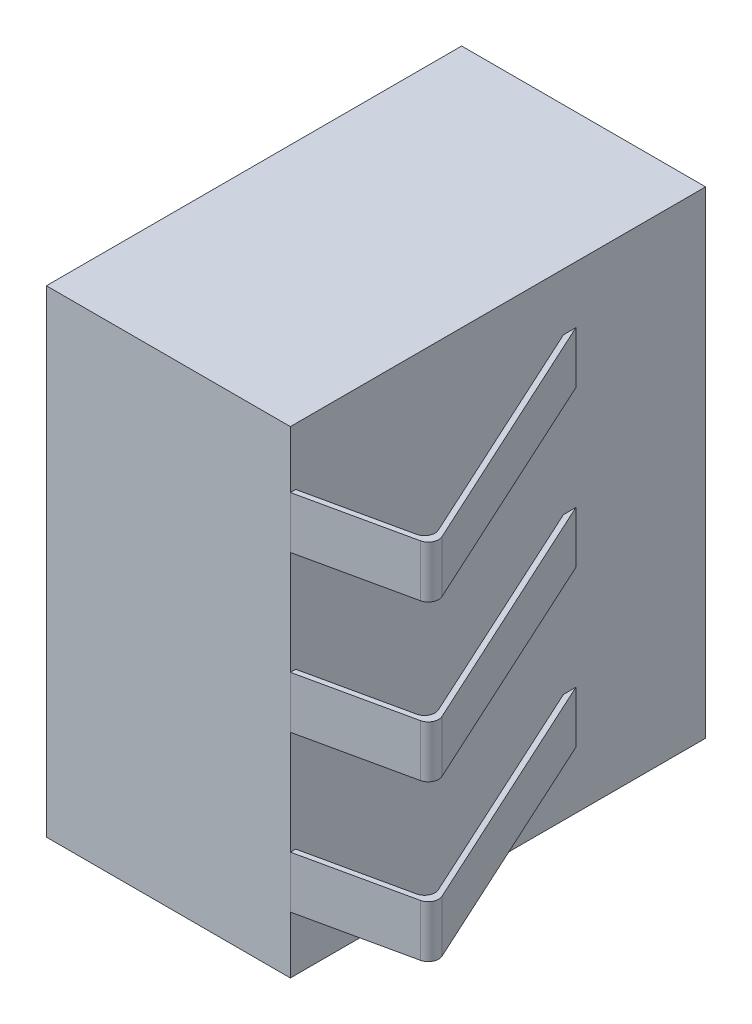
ISO-10303-21;
HEADER;
FILE_DESCRIPTION(('STEP AP214'),'2;1');
FILE_NAME('part.step','',(''),(''),'','','');
FILE_SCHEMA(('AUTOMOTIVE_DESIGN { 1 0 10303 214 1 1 1 1 }'));
ENDSEC;
DATA;
#1=APPLICATION_CONTEXT('core data for automotive mechanical design processes');
#2=APPLICATION_PROTOCOL_DEFINITION('international standard','automotive_design',2000,#1);
#3=PRODUCT_CONTEXT('',#1,'mechanical');
#4=PRODUCT('Part','Part','',(#3));
#5=PRODUCT_RELATED_PRODUCT_CATEGORY('part','',(#4));
#6=PRODUCT_DEFINITION_FORMATION('','',#4);
#7=PRODUCT_DEFINITION_CONTEXT('part definition',#1,'design');
#8=PRODUCT_DEFINITION('design','',#6,#7);
#9=PRODUCT_DEFINITION_SHAPE('','',#8);
#10=(LENGTH_UNIT() NAMED_UNIT(*) SI_UNIT(.MILLI.,.METRE.));
#11=(NAMED_UNIT(*) PLANE_ANGLE_UNIT() SI_UNIT($,.RADIAN.));
#12=(NAMED_UNIT(*) SI_UNIT($,.STERADIAN.) SOLID_ANGLE_UNIT());
#13=UNCERTAINTY_MEASURE_WITH_UNIT(LENGTH_MEASURE(1.E-05),#10,'distance_accuracy_value','');
#14=(GEOMETRIC_REPRESENTATION_CONTEXT(3) GLOBAL_UNCERTAINTY_ASSIGNED_CONTEXT((#13)) GLOBAL_UNIT_ASSIGNED_CONTEXT((#10,
#11,#12)) REPRESENTATION_CONTEXT('',''));
#15=CARTESIAN_POINT('',(0.,0.,0.));
#16=DIRECTION('',(0.,0.,1.));
#17=DIRECTION('',(1.,0.,0.));
#18=AXIS2_PLACEMENT_3D('',#15,#16,#17);
#19=CARTESIAN_POINT('',(2.35,-4.6,8.));
#20=DIRECTION('',(-1.,0.,0.));
#21=DIRECTION('',(0.,0.,1.));
#22=AXIS2_PLACEMENT_3D('',#19,#20,#21);
#23=PLANE('',#22);
#24=DIRECTION('',(0.,-1.,0.));
#25=VECTOR('',#24,1.);
#26=CARTESIAN_POINT('',(2.35,-2.5,2.73928848531856));
#27=LINE('',#26,#25);
#28=CARTESIAN_POINT('',(2.35,-2.5,2.73928848531856));
#29=VERTEX_POINT('',#28);
#30=CARTESIAN_POINT('',(2.35,-3.5,2.73928848531856));
#31=VERTEX_POINT('',#30);
#32=EDGE_CURVE('E239',#29,#31,#27,.T.);
#33=ORIENTED_EDGE('',*,*,#32,.F.);
#34=DIRECTION('',(0.,0.,1.));
#35=VECTOR('',#34,1.);
#36=CARTESIAN_POINT('',(2.35,-2.5,2.5));
#37=LINE('',#36,#35);
#38=CARTESIAN_POINT('',(2.35,-2.5,2.5));
#39=VERTEX_POINT('',#38);
#40=EDGE_CURVE('E253',#39,#29,#37,.T.);
#41=ORIENTED_EDGE('',*,*,#40,.F.);
#42=DIRECTION('',(0.,-1.,0.));
#43=VECTOR('',#42,1.);
#44=CARTESIAN_POINT('',(2.35,-2.5,2.5));
#45=LINE('',#44,#43);
#46=CARTESIAN_POINT('',(2.35,-3.5,2.5));
#47=VERTEX_POINT('',#46);
#48=EDGE_CURVE('E269',#39,#47,#45,.T.);
#49=ORIENTED_EDGE('',*,*,#48,.T.);
#50=DIRECTION('',(0.,0.,1.));
#51=VECTOR('',#50,1.);
#52=CARTESIAN_POINT('',(2.35,-3.5,2.5));
#53=LINE('',#52,#51);
#54=EDGE_CURVE('E263',#47,#31,#53,.T.);
#55=ORIENTED_EDGE('',*,*,#54,.T.);
#56=EDGE_LOOP('',(#33,#41,#49,#55));
#57=FACE_BOUND('',#56,.T.);
#58=DIRECTION('',(0.,-1.,0.));
#59=VECTOR('',#58,1.);
#60=CARTESIAN_POINT('',(2.35,3.5,2.73928848531856));
#61=LINE('',#60,#59);
#62=CARTESIAN_POINT('',(2.35,3.5,2.73928848531856));
#63=VERTEX_POINT('',#62);
#64=CARTESIAN_POINT('',(2.35,2.5,2.73928848531856));
#65=VERTEX_POINT('',#64);
#66=EDGE_CURVE('E308',#63,#65,#61,.T.);
#67=ORIENTED_EDGE('',*,*,#66,.F.);
#68=DIRECTION('',(0.,0.,1.));
#69=VECTOR('',#68,1.);
#70=CARTESIAN_POINT('',(2.35,3.5,2.5));
#71=LINE('',#70,#69);
#72=CARTESIAN_POINT('',(2.35,3.5,2.5));
#73=VERTEX_POINT('',#72);
#74=EDGE_CURVE('E284',#73,#63,#71,.T.);
#75=ORIENTED_EDGE('',*,*,#74,.F.);
#76=DIRECTION('',(0.,-1.,0.));
#77=VECTOR('',#76,1.);
#78=CARTESIAN_POINT('',(2.35,3.5,2.5));
#79=LINE('',#78,#77);
#80=CARTESIAN_POINT('',(2.35,2.5,2.5));
#81=VERTEX_POINT('',#80);
#82=EDGE_CURVE('E311',#73,#81,#79,.T.);
#83=ORIENTED_EDGE('',*,*,#82,.T.);
#84=DIRECTION('',(0.,0.,1.));
#85=VECTOR('',#84,1.);
#86=CARTESIAN_POINT('',(2.35,2.5,2.5));
#87=LINE('',#86,#85);
#88=EDGE_CURVE('E300',#81,#65,#87,.T.);
#89=ORIENTED_EDGE('',*,*,#88,.T.);
#90=EDGE_LOOP('',(#67,#75,#83,#89));
#91=FACE_BOUND('',#90,.T.);
#92=DIRECTION('',(0.,-1.,0.));
#93=VECTOR('',#92,1.);
#94=CARTESIAN_POINT('',(2.35,0.5,2.73928848531856));
#95=LINE('',#94,#93);
#96=CARTESIAN_POINT('',(2.35,0.5,2.73928848531856));
#97=VERTEX_POINT('',#96);
#98=CARTESIAN_POINT('',(2.35,-0.5,2.73928848531856));
#99=VERTEX_POINT('',#98);
#100=EDGE_CURVE('E349',#97,#99,#95,.T.);
#101=ORIENTED_EDGE('',*,*,#100,.F.);
#102=DIRECTION('',(0.,0.,1.));
#103=VECTOR('',#102,1.);
#104=CARTESIAN_POINT('',(2.35,0.5,2.5));
#105=LINE('',#104,#103);
#106=CARTESIAN_POINT('',(2.35,0.5,2.5));
#107=VERTEX_POINT('',#106);
#108=EDGE_CURVE('E326',#107,#97,#105,.T.);
#109=ORIENTED_EDGE('',*,*,#108,.F.);
#110=DIRECTION('',(0.,-1.,0.));
#111=VECTOR('',#110,1.);
#112=CARTESIAN_POINT('',(2.35,0.5,2.5));
#113=LINE('',#112,#111);
#114=CARTESIAN_POINT('',(2.35,-0.5,2.5));
#115=VERTEX_POINT('',#114);
#116=EDGE_CURVE('E352',#107,#115,#113,.T.);
#117=ORIENTED_EDGE('',*,*,#116,.T.);
#118=DIRECTION('',(0.,0.,1.));
#119=VECTOR('',#118,1.);
#120=CARTESIAN_POINT('',(2.35,-0.5,2.5));
#121=LINE('',#120,#119);
#122=EDGE_CURVE('E341',#115,#99,#121,.T.);
#123=ORIENTED_EDGE('',*,*,#122,.T.);
#124=EDGE_LOOP('',(#101,#109,#117,#123));
#125=FACE_BOUND('',#124,.T.);
#126=DIRECTION('',(0.,1.,0.));
#127=VECTOR('',#126,1.);
#128=CARTESIAN_POINT('',(2.35,-4.6,8.));
#129=LINE('',#128,#127);
#130=CARTESIAN_POINT('',(2.35,-2.5,8.));
#131=VERTEX_POINT('',#130);
#132=CARTESIAN_POINT('',(2.35,-0.5,8.));
#133=VERTEX_POINT('',#132);
#134=EDGE_CURVE('E243',#131,#133,#129,.T.);
#135=ORIENTED_EDGE('',*,*,#134,.F.);
#136=DIRECTION('',(0.,0.,1.));
#137=VECTOR('',#136,1.);
#138=CARTESIAN_POINT('',(2.35,-2.5,7.89766432786139));
#139=LINE('',#138,#137);
#140=CARTESIAN_POINT('',(2.35,-2.5,7.89766432786139));
#141=VERTEX_POINT('',#140);
#142=EDGE_CURVE('E222',#141,#131,#139,.T.);
#143=ORIENTED_EDGE('',*,*,#142,.F.);
#144=DIRECTION('',(0.,-1.,0.));
#145=VECTOR('',#144,1.);
#146=CARTESIAN_POINT('',(2.35,-2.5,7.89766432786139));
#147=LINE('',#146,#145);
#148=CARTESIAN_POINT('',(2.35,-3.5,7.89766432786139));
#149=VERTEX_POINT('',#148);
#150=EDGE_CURVE('E229',#141,#149,#147,.T.);
#151=ORIENTED_EDGE('',*,*,#150,.T.);
#152=DIRECTION('',(0.,0.,1.));
#153=VECTOR('',#152,1.);
#154=CARTESIAN_POINT('',(2.35,-3.5,7.89766432786139));
#155=LINE('',#154,#153);
#156=CARTESIAN_POINT('',(2.35,-3.5,8.));
#157=VERTEX_POINT('',#156);
#158=EDGE_CURVE('E257',#149,#157,#155,.T.);
#159=ORIENTED_EDGE('',*,*,#158,.T.);
#160=CARTESIAN_POINT('',(2.35,-4.6,8.));
#161=VERTEX_POINT('',#160);
#162=EDGE_CURVE('E359',#161,#157,#129,.T.);
#163=ORIENTED_EDGE('',*,*,#162,.F.);
#164=DIRECTION('',(0.,0.,-1.));
#165=VECTOR('',#164,1.);
#166=CARTESIAN_POINT('',(2.35,-4.6,8.));
#167=LINE('',#166,#165);
#168=CARTESIAN_POINT('',(2.35,-4.6,0.));
#169=VERTEX_POINT('',#168);
#170=EDGE_CURVE('E369',#161,#169,#167,.T.);
#171=ORIENTED_EDGE('',*,*,#170,.T.);
#172=DIRECTION('',(0.,1.,0.));
#173=VECTOR('',#172,1.);
#174=CARTESIAN_POINT('',(2.35,-4.6,0.));
#175=LINE('',#174,#173);
#176=CARTESIAN_POINT('',(2.35,4.6,0.));
#177=VERTEX_POINT('',#176);
#178=EDGE_CURVE('E358',#169,#177,#175,.T.);
#179=ORIENTED_EDGE('',*,*,#178,.T.);
#180=DIRECTION('',(0.,0.,-1.));
#181=VECTOR('',#180,1.);
#182=CARTESIAN_POINT('',(2.35,4.6,8.));
#183=LINE('',#182,#181);
#184=CARTESIAN_POINT('',(2.35,4.6,8.));
#185=VERTEX_POINT('',#184);
#186=EDGE_CURVE('E387',#185,#177,#183,.T.);
#187=ORIENTED_EDGE('',*,*,#186,.F.);
#188=CARTESIAN_POINT('',(2.35,3.5,8.));
#189=VERTEX_POINT('',#188);
#190=EDGE_CURVE('E378',#189,#185,#129,.T.);
#191=ORIENTED_EDGE('',*,*,#190,.F.);
#192=DIRECTION('',(0.,0.,1.));
#193=VECTOR('',#192,1.);
#194=CARTESIAN_POINT('',(2.35,3.5,7.89766432786139));
#195=LINE('',#194,#193);
#196=CARTESIAN_POINT('',(2.35,3.5,7.89766432786139));
#197=VERTEX_POINT('',#196);
#198=EDGE_CURVE('E276',#197,#189,#195,.T.);
#199=ORIENTED_EDGE('',*,*,#198,.F.);
#200=DIRECTION('',(0.,-1.,0.));
#201=VECTOR('',#200,1.);
#202=CARTESIAN_POINT('',(2.35,3.5,7.89766432786139));
#203=LINE('',#202,#201);
#204=CARTESIAN_POINT('',(2.35,2.5,7.89766432786139));
#205=VERTEX_POINT('',#204);
#206=EDGE_CURVE('E292',#197,#205,#203,.T.);
#207=ORIENTED_EDGE('',*,*,#206,.T.);
#208=DIRECTION('',(0.,0.,1.));
#209=VECTOR('',#208,1.);
#210=CARTESIAN_POINT('',(2.35,2.5,7.89766432786139));
#211=LINE('',#210,#209);
#212=CARTESIAN_POINT('',(2.35,2.5,8.));
#213=VERTEX_POINT('',#212);
#214=EDGE_CURVE('E275',#205,#213,#211,.T.);
#215=ORIENTED_EDGE('',*,*,#214,.T.);
#216=CARTESIAN_POINT('',(2.35,0.5,8.));
#217=VERTEX_POINT('',#216);
#218=EDGE_CURVE('E363',#217,#213,#129,.T.);
#219=ORIENTED_EDGE('',*,*,#218,.F.);
#220=DIRECTION('',(0.,0.,1.));
#221=VECTOR('',#220,1.);
#222=CARTESIAN_POINT('',(2.35,0.5,7.89766432786139));
#223=LINE('',#222,#221);
#224=CARTESIAN_POINT('',(2.35,0.5,7.89766432786139));
#225=VERTEX_POINT('',#224);
#226=EDGE_CURVE('E318',#225,#217,#223,.T.);
#227=ORIENTED_EDGE('',*,*,#226,.F.);
#228=DIRECTION('',(0.,-1.,0.));
#229=VECTOR('',#228,1.);
#230=CARTESIAN_POINT('',(2.35,0.5,7.89766432786139));
#231=LINE('',#230,#229);
#232=CARTESIAN_POINT('',(2.35,-0.5,7.89766432786139));
#233=VERTEX_POINT('',#232);
#234=EDGE_CURVE('E334',#225,#233,#231,.T.);
#235=ORIENTED_EDGE('',*,*,#234,.T.);
#236=DIRECTION('',(0.,0.,1.));
#237=VECTOR('',#236,1.);
#238=CARTESIAN_POINT('',(2.35,-0.5,7.89766432786139));
#239=LINE('',#238,#237);
#240=EDGE_CURVE('E317',#233,#133,#239,.T.);
#241=ORIENTED_EDGE('',*,*,#240,.T.);
#242=EDGE_LOOP('',(#135,#143,#151,#159,#163,#171,#179,#187,#191,#199,#207,#215,#219,#227,#235,#241));
#243=FACE_BOUND('',#242,.T.);
#244=ADVANCED_FACE('F35',(#57,#91,#125,#243),#23,.F.);
#245=CARTESIAN_POINT('',(-2.35,4.6,8.));
#246=DIRECTION('',(0.,-1.,0.));
#247=DIRECTION('',(0.,0.,-1.));
#248=AXIS2_PLACEMENT_3D('',#245,#246,#247);
#249=PLANE('',#248);
#250=DIRECTION('',(-1.,0.,0.));
#251=VECTOR('',#250,1.);
#252=CARTESIAN_POINT('',(-2.35,4.6,0.));
#253=LINE('',#252,#251);
#254=CARTESIAN_POINT('',(-2.35,4.6,0.));
#255=VERTEX_POINT('',#254);
#256=EDGE_CURVE('E372',#177,#255,#253,.T.);
#257=ORIENTED_EDGE('',*,*,#256,.T.);
#258=DIRECTION('',(0.,0.,-1.));
#259=VECTOR('',#258,1.);
#260=CARTESIAN_POINT('',(-2.35,4.6,8.));
#261=LINE('',#260,#259);
#262=CARTESIAN_POINT('',(-2.35,4.6,8.));
#263=VERTEX_POINT('',#262);
#264=EDGE_CURVE('E384',#263,#255,#261,.T.);
#265=ORIENTED_EDGE('',*,*,#264,.F.);
#266=DIRECTION('',(-1.,0.,0.));
#267=VECTOR('',#266,1.);
#268=CARTESIAN_POINT('',(-2.35,4.6,8.));
#269=LINE('',#268,#267);
#270=EDGE_CURVE('E362',#185,#263,#269,.T.);
#271=ORIENTED_EDGE('',*,*,#270,.F.);
#272=ORIENTED_EDGE('',*,*,#186,.T.);
#273=EDGE_LOOP('',(#257,#265,#271,#272));
#274=FACE_BOUND('',#273,.T.);
#275=ADVANCED_FACE('F473',(#274),#249,.F.);
#276=CARTESIAN_POINT('',(-2.35,-4.6,8.));
#277=DIRECTION('',(1.,0.,0.));
#278=DIRECTION('',(0.,0.,-1.));
#279=AXIS2_PLACEMENT_3D('',#276,#277,#278);
#280=PLANE('',#279);
#281=DIRECTION('',(0.,-1.,0.));
#282=VECTOR('',#281,1.);
#283=CARTESIAN_POINT('',(-2.35,-4.6,0.));
#284=LINE('',#283,#282);
#285=CARTESIAN_POINT('',(-2.35,-4.6,0.));
#286=VERTEX_POINT('',#285);
#287=EDGE_CURVE('E374',#255,#286,#284,.T.);
#288=ORIENTED_EDGE('',*,*,#287,.T.);
#289=DIRECTION('',(0.,0.,-1.));
#290=VECTOR('',#289,1.);
#291=CARTESIAN_POINT('',(-2.35,-4.6,8.));
#292=LINE('',#291,#290);
#293=CARTESIAN_POINT('',(-2.35,-4.6,8.));
#294=VERTEX_POINT('',#293);
#295=EDGE_CURVE('E381',#294,#286,#292,.T.);
#296=ORIENTED_EDGE('',*,*,#295,.F.);
#297=DIRECTION('',(0.,-1.,0.));
#298=VECTOR('',#297,1.);
#299=CARTESIAN_POINT('',(-2.35,-4.6,8.));
#300=LINE('',#299,#298);
#301=EDGE_CURVE('E365',#263,#294,#300,.T.);
#302=ORIENTED_EDGE('',*,*,#301,.F.);
#303=ORIENTED_EDGE('',*,*,#264,.T.);
#304=EDGE_LOOP('',(#288,#296,#302,#303));
#305=FACE_BOUND('',#304,.T.);
#306=ADVANCED_FACE('F530',(#305),#280,.F.);
#307=CARTESIAN_POINT('',(-2.35,-4.6,8.));
#308=DIRECTION('',(0.,1.,0.));
#309=DIRECTION('',(0.,0.,1.));
#310=AXIS2_PLACEMENT_3D('',#307,#308,#309);
#311=PLANE('',#310);
#312=DIRECTION('',(1.,0.,0.));
#313=VECTOR('',#312,1.);
#314=CARTESIAN_POINT('',(-2.35,-4.6,0.));
#315=LINE('',#314,#313);
#316=EDGE_CURVE('E376',#286,#169,#315,.T.);
#317=ORIENTED_EDGE('',*,*,#316,.T.);
#318=ORIENTED_EDGE('',*,*,#170,.F.);
#319=DIRECTION('',(1.,0.,0.));
#320=VECTOR('',#319,1.);
#321=CARTESIAN_POINT('',(-2.35,-4.6,8.));
#322=LINE('',#321,#320);
#323=EDGE_CURVE('E367',#294,#161,#322,.T.);
#324=ORIENTED_EDGE('',*,*,#323,.F.);
#325=ORIENTED_EDGE('',*,*,#295,.T.);
#326=EDGE_LOOP('',(#317,#318,#324,#325));
#327=FACE_BOUND('',#326,.T.);
#328=ADVANCED_FACE('F463',(#327),#311,.F.);
#329=CARTESIAN_POINT('',(0.,0.,8.));
#330=DIRECTION('',(0.,0.,-1.));
#331=DIRECTION('',(-1.,0.,0.));
#332=AXIS2_PLACEMENT_3D('',#329,#330,#331);
#333=PLANE('',#332);
#334=ORIENTED_EDGE('',*,*,#162,.T.);
#335=DIRECTION('',(0.,-1.,0.));
#336=VECTOR('',#335,1.);
#337=CARTESIAN_POINT('',(2.35,-2.5,8.));
#338=LINE('',#337,#336);
#339=EDGE_CURVE('E272',#131,#157,#338,.T.);
#340=ORIENTED_EDGE('',*,*,#339,.F.);
#341=ORIENTED_EDGE('',*,*,#134,.T.);
#342=DIRECTION('',(0.,-1.,0.));
#343=VECTOR('',#342,1.);
#344=CARTESIAN_POINT('',(2.35,0.5,8.));
#345=LINE('',#344,#343);
#346=EDGE_CURVE('E355',#217,#133,#345,.T.);
#347=ORIENTED_EDGE('',*,*,#346,.F.);
#348=ORIENTED_EDGE('',*,*,#218,.T.);
#349=DIRECTION('',(0.,-1.,0.));
#350=VECTOR('',#349,1.);
#351=CARTESIAN_POINT('',(2.35,3.5,8.));
#352=LINE('',#351,#350);
#353=EDGE_CURVE('E314',#189,#213,#352,.T.);
#354=ORIENTED_EDGE('',*,*,#353,.F.);
#355=ORIENTED_EDGE('',*,*,#190,.T.);
#356=ORIENTED_EDGE('',*,*,#270,.T.);
#357=ORIENTED_EDGE('',*,*,#301,.T.);
#358=ORIENTED_EDGE('',*,*,#323,.T.);
#359=EDGE_LOOP('',(#334,#340,#341,#347,#348,#354,#355,#356,#357,#358));
#360=FACE_BOUND('',#359,.T.);
#361=ADVANCED_FACE('F457',(#360),#333,.F.);
#362=CARTESIAN_POINT('',(0.,0.,0.));
#363=DIRECTION('',(0.,0.,-1.));
#364=DIRECTION('',(-1.,0.,0.));
#365=AXIS2_PLACEMENT_3D('',#362,#363,#364);
#366=PLANE('',#365);
#367=ORIENTED_EDGE('',*,*,#178,.F.);
#368=ORIENTED_EDGE('',*,*,#316,.F.);
#369=ORIENTED_EDGE('',*,*,#287,.F.);
#370=ORIENTED_EDGE('',*,*,#256,.F.);
#371=EDGE_LOOP('',(#367,#368,#369,#370));
#372=FACE_BOUND('',#371,.T.);
#373=ADVANCED_FACE('F468',(#372),#366,.T.);
#374=CARTESIAN_POINT('',(2.35,0.5,8.));
#375=DIRECTION('',(-0.212429644331044,0.,-0.977176363922801));
#376=DIRECTION('',(-0.977176363922801,0.,0.212429644331044));
#377=AXIS2_PLACEMENT_3D('',#374,#375,#376);
#378=PLANE('',#377);
#379=DIRECTION('',(0.977176363922801,0.,-0.212429644331044));
#380=VECTOR('',#379,1.);
#381=CARTESIAN_POINT('',(2.35,-0.5,8.));
#382=LINE('',#381,#380);
#383=CARTESIAN_POINT('',(4.40676390626567,-0.5,7.55287741168137));
#384=VERTEX_POINT('',#383);
#385=EDGE_CURVE('E336',#133,#384,#382,.T.);
#386=ORIENTED_EDGE('',*,*,#385,.T.);
#387=DIRECTION('',(0.,-1.,0.));
#388=VECTOR('',#387,1.);
#389=CARTESIAN_POINT('',(4.40676390626567,0.5,7.55287741168137));
#390=LINE('',#389,#388);
#391=CARTESIAN_POINT('',(4.40676390626567,0.5,7.55287741168137));
#392=VERTEX_POINT('',#391);
#393=EDGE_CURVE('E404',#384,#392,#390,.F.);
#394=ORIENTED_EDGE('',*,*,#393,.T.);
#395=DIRECTION('',(0.977176363922801,0.,-0.212429644331044));
#396=VECTOR('',#395,1.);
#397=CARTESIAN_POINT('',(2.35,0.5,8.));
#398=LINE('',#397,#396);
#399=EDGE_CURVE('E320',#217,#392,#398,.T.);
#400=ORIENTED_EDGE('',*,*,#399,.F.);
#401=ORIENTED_EDGE('',*,*,#346,.T.);
#402=EDGE_LOOP('',(#386,#394,#400,#401));
#403=FACE_BOUND('',#402,.T.);
#404=ADVANCED_FACE('F730',(#403),#378,.F.);
#405=CARTESIAN_POINT('',(4.65,0.5,7.5));
#406=DIRECTION('',(-0.908490452678575,0.,0.417905608232144));
#407=DIRECTION('',(0.417905608232144,0.,0.908490452678575));
#408=AXIS2_PLACEMENT_3D('',#405,#406,#407);
#409=PLANE('',#408);
#410=DIRECTION('',(-0.417905608232144,0.,-0.908490452678575));
#411=VECTOR('',#410,1.);
#412=CARTESIAN_POINT('',(4.65,0.5,7.5));
#413=LINE('',#412,#411);
#414=CARTESIAN_POINT('',(4.54597606793518,0.5,7.27386101725039));
#415=VERTEX_POINT('',#414);
#416=EDGE_CURVE('E324',#415,#107,#413,.T.);
#417=ORIENTED_EDGE('',*,*,#416,.F.);
#418=DIRECTION('',(0.,-1.,0.));
#419=VECTOR('',#418,1.);
#420=CARTESIAN_POINT('',(4.54597606793518,0.5,7.27386101725039));
#421=LINE('',#420,#419);
#422=CARTESIAN_POINT('',(4.54597606793518,-0.5,7.27386101725039));
#423=VERTEX_POINT('',#422);
#424=EDGE_CURVE('E399',#415,#423,#421,.T.);
#425=ORIENTED_EDGE('',*,*,#424,.T.);
#426=DIRECTION('',(-0.417905608232144,0.,-0.908490452678575));
#427=VECTOR('',#426,1.);
#428=CARTESIAN_POINT('',(4.65,-0.5,7.5));
#429=LINE('',#428,#427);
#430=EDGE_CURVE('E339',#423,#115,#429,.T.);
#431=ORIENTED_EDGE('',*,*,#430,.T.);
#432=ORIENTED_EDGE('',*,*,#116,.F.);
#433=EDGE_LOOP('',(#417,#425,#431,#432));
#434=FACE_BOUND('',#433,.T.);
#435=ADVANCED_FACE('F721',(#434),#409,.F.);
#436=CARTESIAN_POINT('',(2.35,0.5,2.73928848531856));
#437=DIRECTION('',(0.908490452678575,0.,-0.417905608232144));
#438=DIRECTION('',(-0.417905608232144,0.,-0.908490452678575));
#439=AXIS2_PLACEMENT_3D('',#436,#437,#438);
#440=PLANE('',#439);
#441=DIRECTION('',(0.417905608232144,0.,0.908490452678575));
#442=VECTOR('',#441,1.);
#443=CARTESIAN_POINT('',(2.35,-0.5,2.73928848531856));
#444=LINE('',#443,#442);
#445=CARTESIAN_POINT('',(4.40311505663491,-0.5,7.20258208669879));
#446=VERTEX_POINT('',#445);
#447=EDGE_CURVE('E343',#99,#446,#444,.T.);
#448=ORIENTED_EDGE('',*,*,#447,.T.);
#449=DIRECTION('',(0.,-1.,0.));
#450=VECTOR('',#449,1.);
#451=CARTESIAN_POINT('',(4.40311505663491,0.5,7.20258208669879));
#452=LINE('',#451,#450);
#453=CARTESIAN_POINT('',(4.40311505663491,0.5,7.20258208669879));
#454=VERTEX_POINT('',#453);
#455=EDGE_CURVE('E393',#446,#454,#452,.F.);
#456=ORIENTED_EDGE('',*,*,#455,.T.);
#457=DIRECTION('',(0.417905608232144,0.,0.908490452678575));
#458=VECTOR('',#457,1.);
#459=CARTESIAN_POINT('',(2.35,0.5,2.73928848531856));
#460=LINE('',#459,#458);
#461=EDGE_CURVE('E329',#97,#454,#460,.T.);
#462=ORIENTED_EDGE('',*,*,#461,.F.);
#463=ORIENTED_EDGE('',*,*,#100,.T.);
#464=EDGE_LOOP('',(#448,#456,#462,#463));
#465=FACE_BOUND('',#464,.T.);
#466=ADVANCED_FACE('F712',(#465),#440,.F.);
#467=CARTESIAN_POINT('',(4.50713898869973,0.5,7.42872106944841));
#468=DIRECTION('',(0.212429644331044,0.,0.977176363922801));
#469=DIRECTION('',(0.977176363922801,0.,-0.212429644331044));
#470=AXIS2_PLACEMENT_3D('',#467,#468,#469);
#471=PLANE('',#470);
#472=DIRECTION('',(-0.977176363922801,0.,0.212429644331044));
#473=VECTOR('',#472,1.);
#474=CARTESIAN_POINT('',(4.50713898869973,0.5,7.42872106944841));
#475=LINE('',#474,#473);
#476=CARTESIAN_POINT('',(4.2639028949654,0.5,7.48159848112978));
#477=VERTEX_POINT('',#476);
#478=EDGE_CURVE('E332',#477,#225,#475,.T.);
#479=ORIENTED_EDGE('',*,*,#478,.F.);
#480=DIRECTION('',(0.,-1.,0.));
#481=VECTOR('',#480,1.);
#482=CARTESIAN_POINT('',(4.2639028949654,-0.5,7.48159848112978));
#483=LINE('',#482,#481);
#484=CARTESIAN_POINT('',(4.2639028949654,-0.5,7.48159848112978));
#485=VERTEX_POINT('',#484);
#486=EDGE_CURVE('E390',#477,#485,#483,.T.);
#487=ORIENTED_EDGE('',*,*,#486,.T.);
#488=DIRECTION('',(-0.977176363922801,0.,0.212429644331044));
#489=VECTOR('',#488,1.);
#490=CARTESIAN_POINT('',(4.50713898869973,-0.5,7.42872106944841));
#491=LINE('',#490,#489);
#492=EDGE_CURVE('E321',#485,#233,#491,.T.);
#493=ORIENTED_EDGE('',*,*,#492,.T.);
#494=ORIENTED_EDGE('',*,*,#234,.F.);
#495=EDGE_LOOP('',(#479,#487,#493,#494));
#496=FACE_BOUND('',#495,.T.);
#497=ADVANCED_FACE('F703',(#496),#471,.F.);
#498=CARTESIAN_POINT('',(0.,0.5,0.));
#499=DIRECTION('',(0.,1.,0.));
#500=DIRECTION('',(0.,0.,1.));
#501=AXIS2_PLACEMENT_3D('',#498,#499,#500);
#502=PLANE('',#501);
#503=ORIENTED_EDGE('',*,*,#399,.T.);
#504=CARTESIAN_POINT('',(4.36427797739946,0.5,7.35744213889681));
#505=DIRECTION('',(0.,1.,0.));
#506=DIRECTION('',(0.,0.,1.));
#507=AXIS2_PLACEMENT_3D('',#504,#505,#506);
#508=CIRCLE('',#507,0.2);
#509=EDGE_CURVE('E406',#392,#415,#508,.T.);
#510=ORIENTED_EDGE('',*,*,#509,.T.);
#511=ORIENTED_EDGE('',*,*,#416,.T.);
#512=ORIENTED_EDGE('',*,*,#108,.T.);
#513=ORIENTED_EDGE('',*,*,#461,.T.);
#514=CARTESIAN_POINT('',(4.22141696609919,0.5,7.28616320834522));
#515=DIRECTION('',(0.,1.,0.));
#516=DIRECTION('',(0.,0.,1.));
#517=AXIS2_PLACEMENT_3D('',#514,#515,#516);
#518=CIRCLE('',#517,0.2);
#519=EDGE_CURVE('E397',#454,#477,#518,.F.);
#520=ORIENTED_EDGE('',*,*,#519,.T.);
#521=ORIENTED_EDGE('',*,*,#478,.T.);
#522=ORIENTED_EDGE('',*,*,#226,.T.);
#523=EDGE_LOOP('',(#503,#510,#511,#512,#513,#520,#521,#522));
#524=FACE_BOUND('',#523,.T.);
#525=ADVANCED_FACE('F694',(#524),#502,.T.);
#526=CARTESIAN_POINT('',(0.,-0.5,0.));
#527=DIRECTION('',(0.,1.,0.));
#528=DIRECTION('',(0.,0.,1.));
#529=AXIS2_PLACEMENT_3D('',#526,#527,#528);
#530=PLANE('',#529);
#531=ORIENTED_EDGE('',*,*,#430,.F.);
#532=CARTESIAN_POINT('',(4.36427797739946,-0.5,7.35744213889681));
#533=DIRECTION('',(0.,1.,0.));
#534=DIRECTION('',(0.,0.,1.));
#535=AXIS2_PLACEMENT_3D('',#532,#533,#534);
#536=CIRCLE('',#535,0.2);
#537=EDGE_CURVE('E402',#423,#384,#536,.F.);
#538=ORIENTED_EDGE('',*,*,#537,.T.);
#539=ORIENTED_EDGE('',*,*,#385,.F.);
#540=ORIENTED_EDGE('',*,*,#240,.F.);
#541=ORIENTED_EDGE('',*,*,#492,.F.);
#542=CARTESIAN_POINT('',(4.22141696609919,-0.5,7.28616320834522));
#543=DIRECTION('',(0.,1.,0.));
#544=DIRECTION('',(0.,0.,1.));
#545=AXIS2_PLACEMENT_3D('',#542,#543,#544);
#546=CIRCLE('',#545,0.2);
#547=EDGE_CURVE('E395',#485,#446,#546,.T.);
#548=ORIENTED_EDGE('',*,*,#547,.T.);
#549=ORIENTED_EDGE('',*,*,#447,.F.);
#550=ORIENTED_EDGE('',*,*,#122,.F.);
#551=EDGE_LOOP('',(#531,#538,#539,#540,#541,#548,#549,#550));
#552=FACE_BOUND('',#551,.T.);
#553=ADVANCED_FACE('F538',(#552),#530,.F.);
#554=CARTESIAN_POINT('',(4.22141696609919,0.5,7.28616320834522));
#555=DIRECTION('',(0.,1.,0.));
#556=DIRECTION('',(0.,0.,1.));
#557=AXIS2_PLACEMENT_3D('',#554,#555,#556);
#558=CYLINDRICAL_SURFACE('',#557,0.2);
#559=ORIENTED_EDGE('',*,*,#519,.F.);
#560=ORIENTED_EDGE('',*,*,#455,.F.);
#561=ORIENTED_EDGE('',*,*,#547,.F.);
#562=ORIENTED_EDGE('',*,*,#486,.F.);
#563=EDGE_LOOP('',(#559,#560,#561,#562));
#564=FACE_BOUND('',#563,.T.);
#565=ADVANCED_FACE('F534',(#564),#558,.F.);
#566=CARTESIAN_POINT('',(4.36427797739946,0.5,7.35744213889681));
#567=DIRECTION('',(0.,-1.,0.));
#568=DIRECTION('',(0.,0.,-1.));
#569=AXIS2_PLACEMENT_3D('',#566,#567,#568);
#570=CYLINDRICAL_SURFACE('',#569,0.2);
#571=ORIENTED_EDGE('',*,*,#509,.F.);
#572=ORIENTED_EDGE('',*,*,#393,.F.);
#573=ORIENTED_EDGE('',*,*,#537,.F.);
#574=ORIENTED_EDGE('',*,*,#424,.F.);
#575=EDGE_LOOP('',(#571,#572,#573,#574));
#576=FACE_BOUND('',#575,.T.);
#577=ADVANCED_FACE('F537',(#576),#570,.T.);
#578=CARTESIAN_POINT('',(2.35,3.5,8.));
#579=DIRECTION('',(-0.212429644331044,0.,-0.977176363922801));
#580=DIRECTION('',(-0.977176363922801,0.,0.212429644331044));
#581=AXIS2_PLACEMENT_3D('',#578,#579,#580);
#582=PLANE('',#581);
#583=DIRECTION('',(0.977176363922801,0.,-0.212429644331044));
#584=VECTOR('',#583,1.);
#585=CARTESIAN_POINT('',(2.35,2.5,8.));
#586=LINE('',#585,#584);
#587=CARTESIAN_POINT('',(4.40676390626567,2.5,7.55287741168137));
#588=VERTEX_POINT('',#587);
#589=EDGE_CURVE('E295',#213,#588,#586,.T.);
#590=ORIENTED_EDGE('',*,*,#589,.T.);
#591=DIRECTION('',(0.,-1.,0.));
#592=VECTOR('',#591,1.);
#593=CARTESIAN_POINT('',(4.40676390626567,3.5,7.55287741168137));
#594=LINE('',#593,#592);
#595=CARTESIAN_POINT('',(4.40676390626567,3.5,7.55287741168137));
#596=VERTEX_POINT('',#595);
#597=EDGE_CURVE('E429',#588,#596,#594,.F.);
#598=ORIENTED_EDGE('',*,*,#597,.T.);
#599=DIRECTION('',(0.977176363922801,0.,-0.212429644331044));
#600=VECTOR('',#599,1.);
#601=CARTESIAN_POINT('',(2.35,3.5,8.));
#602=LINE('',#601,#600);
#603=EDGE_CURVE('E278',#189,#596,#602,.T.);
#604=ORIENTED_EDGE('',*,*,#603,.F.);
#605=ORIENTED_EDGE('',*,*,#353,.T.);
#606=EDGE_LOOP('',(#590,#598,#604,#605));
#607=FACE_BOUND('',#606,.T.);
#608=ADVANCED_FACE('F482',(#607),#582,.F.);
#609=CARTESIAN_POINT('',(4.65,3.5,7.5));
#610=DIRECTION('',(-0.908490452678575,0.,0.417905608232144));
#611=DIRECTION('',(0.417905608232144,0.,0.908490452678575));
#612=AXIS2_PLACEMENT_3D('',#609,#610,#611);
#613=PLANE('',#612);
#614=DIRECTION('',(-0.417905608232144,0.,-0.908490452678575));
#615=VECTOR('',#614,1.);
#616=CARTESIAN_POINT('',(4.65,3.5,7.5));
#617=LINE('',#616,#615);
#618=CARTESIAN_POINT('',(4.54597606793518,3.5,7.27386101725039));
#619=VERTEX_POINT('',#618);
#620=EDGE_CURVE('E282',#619,#73,#617,.T.);
#621=ORIENTED_EDGE('',*,*,#620,.F.);
#622=DIRECTION('',(0.,-1.,0.));
#623=VECTOR('',#622,1.);
#624=CARTESIAN_POINT('',(4.54597606793518,3.5,7.27386101725039));
#625=LINE('',#624,#623);
#626=CARTESIAN_POINT('',(4.54597606793518,2.5,7.27386101725039));
#627=VERTEX_POINT('',#626);
#628=EDGE_CURVE('E424',#619,#627,#625,.T.);
#629=ORIENTED_EDGE('',*,*,#628,.T.);
#630=DIRECTION('',(-0.417905608232144,0.,-0.908490452678575));
#631=VECTOR('',#630,1.);
#632=CARTESIAN_POINT('',(4.65,2.5,7.5));
#633=LINE('',#632,#631);
#634=EDGE_CURVE('E298',#627,#81,#633,.T.);
#635=ORIENTED_EDGE('',*,*,#634,.T.);
#636=ORIENTED_EDGE('',*,*,#82,.F.);
#637=EDGE_LOOP('',(#621,#629,#635,#636));
#638=FACE_BOUND('',#637,.T.);
#639=ADVANCED_FACE('F498',(#638),#613,.F.);
#640=CARTESIAN_POINT('',(2.35,3.5,2.73928848531856));
#641=DIRECTION('',(0.908490452678575,0.,-0.417905608232144));
#642=DIRECTION('',(-0.417905608232144,0.,-0.908490452678575));
#643=AXIS2_PLACEMENT_3D('',#640,#641,#642);
#644=PLANE('',#643);
#645=DIRECTION('',(0.417905608232144,0.,0.908490452678575));
#646=VECTOR('',#645,1.);
#647=CARTESIAN_POINT('',(2.35,2.5,2.73928848531856));
#648=LINE('',#647,#646);
#649=CARTESIAN_POINT('',(4.40311505663491,2.5,7.20258208669879));
#650=VERTEX_POINT('',#649);
#651=EDGE_CURVE('E302',#65,#650,#648,.T.);
#652=ORIENTED_EDGE('',*,*,#651,.T.);
#653=DIRECTION('',(0.,-1.,0.));
#654=VECTOR('',#653,1.);
#655=CARTESIAN_POINT('',(4.40311505663491,3.5,7.20258208669879));
#656=LINE('',#655,#654);
#657=CARTESIAN_POINT('',(4.40311505663491,3.5,7.20258208669879));
#658=VERTEX_POINT('',#657);
#659=EDGE_CURVE('E411',#650,#658,#656,.F.);
#660=ORIENTED_EDGE('',*,*,#659,.T.);
#661=DIRECTION('',(0.417905608232144,0.,0.908490452678575));
#662=VECTOR('',#661,1.);
#663=CARTESIAN_POINT('',(2.35,3.5,2.73928848531856));
#664=LINE('',#663,#662);
#665=EDGE_CURVE('E287',#63,#658,#664,.T.);
#666=ORIENTED_EDGE('',*,*,#665,.F.);
#667=ORIENTED_EDGE('',*,*,#66,.T.);
#668=EDGE_LOOP('',(#652,#660,#666,#667));
#669=FACE_BOUND('',#668,.T.);
#670=ADVANCED_FACE('F507',(#669),#644,.F.);
#671=CARTESIAN_POINT('',(4.50713898869973,3.5,7.42872106944841));
#672=DIRECTION('',(0.212429644331044,0.,0.977176363922801));
#673=DIRECTION('',(0.977176363922801,0.,-0.212429644331044));
#674=AXIS2_PLACEMENT_3D('',#671,#672,#673);
#675=PLANE('',#674);
#676=DIRECTION('',(-0.977176363922801,0.,0.212429644331044));
#677=VECTOR('',#676,1.);
#678=CARTESIAN_POINT('',(4.50713898869973,3.5,7.42872106944841));
#679=LINE('',#678,#677);
#680=CARTESIAN_POINT('',(4.2639028949654,3.5,7.48159848112978));
#681=VERTEX_POINT('',#680);
#682=EDGE_CURVE('E290',#681,#197,#679,.T.);
#683=ORIENTED_EDGE('',*,*,#682,.F.);
#684=DIRECTION('',(0.,-1.,0.));
#685=VECTOR('',#684,1.);
#686=CARTESIAN_POINT('',(4.2639028949654,2.5,7.48159848112978));
#687=LINE('',#686,#685);
#688=CARTESIAN_POINT('',(4.2639028949654,2.5,7.48159848112978));
#689=VERTEX_POINT('',#688);
#690=EDGE_CURVE('E408',#681,#689,#687,.T.);
#691=ORIENTED_EDGE('',*,*,#690,.T.);
#692=DIRECTION('',(-0.977176363922801,0.,0.212429644331044));
#693=VECTOR('',#692,1.);
#694=CARTESIAN_POINT('',(4.50713898869973,2.5,7.42872106944841));
#695=LINE('',#694,#693);
#696=EDGE_CURVE('E279',#689,#205,#695,.T.);
#697=ORIENTED_EDGE('',*,*,#696,.T.);
#698=ORIENTED_EDGE('',*,*,#206,.F.);
#699=EDGE_LOOP('',(#683,#691,#697,#698));
#700=FACE_BOUND('',#699,.T.);
#701=ADVANCED_FACE('F515',(#700),#675,.F.);
#702=CARTESIAN_POINT('',(0.,3.5,0.));
#703=DIRECTION('',(0.,1.,0.));
#704=DIRECTION('',(0.,0.,1.));
#705=AXIS2_PLACEMENT_3D('',#702,#703,#704);
#706=PLANE('',#705);
#707=ORIENTED_EDGE('',*,*,#603,.T.);
#708=CARTESIAN_POINT('',(4.36427797739946,3.5,7.35744213889681));
#709=DIRECTION('',(0.,1.,0.));
#710=DIRECTION('',(0.,0.,1.));
#711=AXIS2_PLACEMENT_3D('',#708,#709,#710);
#712=CIRCLE('',#711,0.2);
#713=EDGE_CURVE('E431',#596,#619,#712,.T.);
#714=ORIENTED_EDGE('',*,*,#713,.T.);
#715=ORIENTED_EDGE('',*,*,#620,.T.);
#716=ORIENTED_EDGE('',*,*,#74,.T.);
#717=ORIENTED_EDGE('',*,*,#665,.T.);
#718=CARTESIAN_POINT('',(4.22141696609919,3.5,7.28616320834522));
#719=DIRECTION('',(0.,1.,0.));
#720=DIRECTION('',(0.,0.,1.));
#721=AXIS2_PLACEMENT_3D('',#718,#719,#720);
#722=CIRCLE('',#721,0.2);
#723=EDGE_CURVE('E415',#658,#681,#722,.F.);
#724=ORIENTED_EDGE('',*,*,#723,.T.);
#725=ORIENTED_EDGE('',*,*,#682,.T.);
#726=ORIENTED_EDGE('',*,*,#198,.T.);
#727=EDGE_LOOP('',(#707,#714,#715,#716,#717,#724,#725,#726));
#728=FACE_BOUND('',#727,.T.);
#729=ADVANCED_FACE('F502',(#728),#706,.T.);
#730=CARTESIAN_POINT('',(0.,2.5,0.));
#731=DIRECTION('',(0.,1.,0.));
#732=DIRECTION('',(0.,0.,1.));
#733=AXIS2_PLACEMENT_3D('',#730,#731,#732);
#734=PLANE('',#733);
#735=ORIENTED_EDGE('',*,*,#634,.F.);
#736=CARTESIAN_POINT('',(4.36427797739946,2.5,7.35744213889681));
#737=DIRECTION('',(0.,1.,0.));
#738=DIRECTION('',(0.,0.,1.));
#739=AXIS2_PLACEMENT_3D('',#736,#737,#738);
#740=CIRCLE('',#739,0.2);
#741=EDGE_CURVE('E427',#627,#588,#740,.F.);
#742=ORIENTED_EDGE('',*,*,#741,.T.);
#743=ORIENTED_EDGE('',*,*,#589,.F.);
#744=ORIENTED_EDGE('',*,*,#214,.F.);
#745=ORIENTED_EDGE('',*,*,#696,.F.);
#746=CARTESIAN_POINT('',(4.22141696609919,2.5,7.28616320834522));
#747=DIRECTION('',(0.,1.,0.));
#748=DIRECTION('',(0.,0.,1.));
#749=AXIS2_PLACEMENT_3D('',#746,#747,#748);
#750=CIRCLE('',#749,0.2);
#751=EDGE_CURVE('E413',#689,#650,#750,.T.);
#752=ORIENTED_EDGE('',*,*,#751,.T.);
#753=ORIENTED_EDGE('',*,*,#651,.F.);
#754=ORIENTED_EDGE('',*,*,#88,.F.);
#755=EDGE_LOOP('',(#735,#742,#743,#744,#745,#752,#753,#754));
#756=FACE_BOUND('',#755,.T.);
#757=ADVANCED_FACE('F490',(#756),#734,.F.);
#758=CARTESIAN_POINT('',(2.35,-2.5,8.));
#759=DIRECTION('',(-0.212429644331044,0.,-0.977176363922801));
#760=DIRECTION('',(-0.977176363922801,0.,0.212429644331044));
#761=AXIS2_PLACEMENT_3D('',#758,#759,#760);
#762=PLANE('',#761);
#763=DIRECTION('',(0.977176363922801,0.,-0.212429644331044));
#764=VECTOR('',#763,1.);
#765=CARTESIAN_POINT('',(2.35,-3.5,8.));
#766=LINE('',#765,#764);
#767=CARTESIAN_POINT('',(4.40676390626567,-3.5,7.55287741168137));
#768=VERTEX_POINT('',#767);
#769=EDGE_CURVE('E259',#157,#768,#766,.T.);
#770=ORIENTED_EDGE('',*,*,#769,.T.);
#771=DIRECTION('',(0.,-1.,0.));
#772=VECTOR('',#771,1.);
#773=CARTESIAN_POINT('',(4.40676390626567,-2.5,7.55287741168137));
#774=LINE('',#773,#772);
#775=CARTESIAN_POINT('',(4.40676390626567,-2.5,7.55287741168137));
#776=VERTEX_POINT('',#775);
#777=EDGE_CURVE('E43',#768,#776,#774,.F.);
#778=ORIENTED_EDGE('',*,*,#777,.T.);
#779=DIRECTION('',(0.977176363922801,0.,-0.212429644331044));
#780=VECTOR('',#779,1.);
#781=CARTESIAN_POINT('',(2.35,-2.5,8.));
#782=LINE('',#781,#780);
#783=EDGE_CURVE('E245',#131,#776,#782,.T.);
#784=ORIENTED_EDGE('',*,*,#783,.F.);
#785=ORIENTED_EDGE('',*,*,#339,.T.);
#786=EDGE_LOOP('',(#770,#778,#784,#785));
#787=FACE_BOUND('',#786,.T.);
#788=ADVANCED_FACE('F552',(#787),#762,.F.);
#789=CARTESIAN_POINT('',(4.65,-2.5,7.5));
#790=DIRECTION('',(-0.908490452678575,0.,0.417905608232144));
#791=DIRECTION('',(0.417905608232144,0.,0.908490452678575));
#792=AXIS2_PLACEMENT_3D('',#789,#790,#791);
#793=PLANE('',#792);
#794=DIRECTION('',(-0.417905608232144,0.,-0.908490452678575));
#795=VECTOR('',#794,1.);
#796=CARTESIAN_POINT('',(4.65,-2.5,7.5));
#797=LINE('',#796,#795);
#798=CARTESIAN_POINT('',(4.54597606793518,-2.5,7.27386101725039));
#799=VERTEX_POINT('',#798);
#800=EDGE_CURVE('E247',#799,#39,#797,.T.);
#801=ORIENTED_EDGE('',*,*,#800,.F.);
#802=DIRECTION('',(0.,-1.,0.));
#803=VECTOR('',#802,1.);
#804=CARTESIAN_POINT('',(4.54597606793518,-2.5,7.27386101725039));
#805=LINE('',#804,#803);
#806=CARTESIAN_POINT('',(4.54597606793518,-3.5,7.27386101725039));
#807=VERTEX_POINT('',#806);
#808=EDGE_CURVE('E433',#799,#807,#805,.T.);
#809=ORIENTED_EDGE('',*,*,#808,.T.);
#810=DIRECTION('',(-0.417905608232144,0.,-0.908490452678575));
#811=VECTOR('',#810,1.);
#812=CARTESIAN_POINT('',(4.65,-3.5,7.5));
#813=LINE('',#812,#811);
#814=EDGE_CURVE('E261',#807,#47,#813,.T.);
#815=ORIENTED_EDGE('',*,*,#814,.T.);
#816=ORIENTED_EDGE('',*,*,#48,.F.);
#817=EDGE_LOOP('',(#801,#809,#815,#816));
#818=FACE_BOUND('',#817,.T.);
#819=ADVANCED_FACE('F439',(#818),#793,.F.);
#820=CARTESIAN_POINT('',(2.35,-2.5,2.73928848531856));
#821=DIRECTION('',(0.908490452678575,0.,-0.417905608232144));
#822=DIRECTION('',(-0.417905608232144,0.,-0.908490452678575));
#823=AXIS2_PLACEMENT_3D('',#820,#821,#822);
#824=PLANE('',#823);
#825=DIRECTION('',(0.417905608232144,0.,0.908490452678575));
#826=VECTOR('',#825,1.);
#827=CARTESIAN_POINT('',(2.35,-3.5,2.73928848531856));
#828=LINE('',#827,#826);
#829=CARTESIAN_POINT('',(4.40311505663491,-3.5,7.20258208669879));
#830=VERTEX_POINT('',#829);
#831=EDGE_CURVE('E249',#31,#830,#828,.T.);
#832=ORIENTED_EDGE('',*,*,#831,.T.);
#833=DIRECTION('',(0.,-1.,0.));
#834=VECTOR('',#833,1.);
#835=CARTESIAN_POINT('',(4.40311505663491,-2.5,7.20258208669879));
#836=LINE('',#835,#834);
#837=CARTESIAN_POINT('',(4.40311505663491,-2.5,7.20258208669879));
#838=VERTEX_POINT('',#837);
#839=EDGE_CURVE('E419',#830,#838,#836,.F.);
#840=ORIENTED_EDGE('',*,*,#839,.T.);
#841=DIRECTION('',(0.417905608232144,0.,0.908490452678575));
#842=VECTOR('',#841,1.);
#843=CARTESIAN_POINT('',(2.35,-2.5,2.73928848531856));
#844=LINE('',#843,#842);
#845=EDGE_CURVE('E230',#29,#838,#844,.T.);
#846=ORIENTED_EDGE('',*,*,#845,.F.);
#847=ORIENTED_EDGE('',*,*,#32,.T.);
#848=EDGE_LOOP('',(#832,#840,#846,#847));
#849=FACE_BOUND('',#848,.T.);
#850=ADVANCED_FACE('F451',(#849),#824,.F.);
#851=CARTESIAN_POINT('',(4.50713898869973,-2.5,7.42872106944841));
#852=DIRECTION('',(0.212429644331044,0.,0.977176363922801));
#853=DIRECTION('',(0.977176363922801,0.,-0.212429644331044));
#854=AXIS2_PLACEMENT_3D('',#851,#852,#853);
#855=PLANE('',#854);
#856=DIRECTION('',(-0.977176363922801,0.,0.212429644331044));
#857=VECTOR('',#856,1.);
#858=CARTESIAN_POINT('',(4.50713898869973,-2.5,7.42872106944841));
#859=LINE('',#858,#857);
#860=CARTESIAN_POINT('',(4.2639028949654,-2.5,7.48159848112978));
#861=VERTEX_POINT('',#860);
#862=EDGE_CURVE('E218',#861,#141,#859,.T.);
#863=ORIENTED_EDGE('',*,*,#862,.F.);
#864=DIRECTION('',(0.,-1.,0.));
#865=VECTOR('',#864,1.);
#866=CARTESIAN_POINT('',(4.2639028949654,-3.5,7.48159848112978));
#867=LINE('',#866,#865);
#868=CARTESIAN_POINT('',(4.2639028949654,-3.5,7.48159848112978));
#869=VERTEX_POINT('',#868);
#870=EDGE_CURVE('E417',#861,#869,#867,.T.);
#871=ORIENTED_EDGE('',*,*,#870,.T.);
#872=DIRECTION('',(-0.977176363922801,0.,0.212429644331044));
#873=VECTOR('',#872,1.);
#874=CARTESIAN_POINT('',(4.50713898869973,-3.5,7.42872106944841));
#875=LINE('',#874,#873);
#876=EDGE_CURVE('E235',#869,#149,#875,.T.);
#877=ORIENTED_EDGE('',*,*,#876,.T.);
#878=ORIENTED_EDGE('',*,*,#150,.F.);
#879=EDGE_LOOP('',(#863,#871,#877,#878));
#880=FACE_BOUND('',#879,.T.);
#881=ADVANCED_FACE('F233',(#880),#855,.F.);
#882=CARTESIAN_POINT('',(0.,-2.5,0.));
#883=DIRECTION('',(0.,1.,0.));
#884=DIRECTION('',(0.,0.,1.));
#885=AXIS2_PLACEMENT_3D('',#882,#883,#884);
#886=PLANE('',#885);
#887=ORIENTED_EDGE('',*,*,#783,.T.);
#888=CARTESIAN_POINT('',(4.36427797739946,-2.5,7.35744213889681));
#889=DIRECTION('',(0.,1.,0.));
#890=DIRECTION('',(0.,0.,1.));
#891=AXIS2_PLACEMENT_3D('',#888,#889,#890);
#892=CIRCLE('',#891,0.2);
#893=EDGE_CURVE('E11',#776,#799,#892,.T.);
#894=ORIENTED_EDGE('',*,*,#893,.T.);
#895=ORIENTED_EDGE('',*,*,#800,.T.);
#896=ORIENTED_EDGE('',*,*,#40,.T.);
#897=ORIENTED_EDGE('',*,*,#845,.T.);
#898=CARTESIAN_POINT('',(4.22141696609919,-2.5,7.28616320834522));
#899=DIRECTION('',(0.,1.,0.));
#900=DIRECTION('',(0.,0.,1.));
#901=AXIS2_PLACEMENT_3D('',#898,#899,#900);
#902=CIRCLE('',#901,0.2);
#903=EDGE_CURVE('E225',#838,#861,#902,.F.);
#904=ORIENTED_EDGE('',*,*,#903,.T.);
#905=ORIENTED_EDGE('',*,*,#862,.T.);
#906=ORIENTED_EDGE('',*,*,#142,.T.);
#907=EDGE_LOOP('',(#887,#894,#895,#896,#897,#904,#905,#906));
#908=FACE_BOUND('',#907,.T.);
#909=ADVANCED_FACE('F220',(#908),#886,.T.);
#910=CARTESIAN_POINT('',(0.,-3.5,0.));
#911=DIRECTION('',(0.,1.,0.));
#912=DIRECTION('',(0.,0.,1.));
#913=AXIS2_PLACEMENT_3D('',#910,#911,#912);
#914=PLANE('',#913);
#915=ORIENTED_EDGE('',*,*,#814,.F.);
#916=CARTESIAN_POINT('',(4.36427797739946,-3.5,7.35744213889681));
#917=DIRECTION('',(0.,1.,0.));
#918=DIRECTION('',(0.,0.,1.));
#919=AXIS2_PLACEMENT_3D('',#916,#917,#918);
#920=CIRCLE('',#919,0.2);
#921=EDGE_CURVE('E57',#807,#768,#920,.F.);
#922=ORIENTED_EDGE('',*,*,#921,.T.);
#923=ORIENTED_EDGE('',*,*,#769,.F.);
#924=ORIENTED_EDGE('',*,*,#158,.F.);
#925=ORIENTED_EDGE('',*,*,#876,.F.);
#926=CARTESIAN_POINT('',(4.22141696609919,-3.5,7.28616320834522));
#927=DIRECTION('',(0.,1.,0.));
#928=DIRECTION('',(0.,0.,1.));
#929=AXIS2_PLACEMENT_3D('',#926,#927,#928);
#930=CIRCLE('',#929,0.2);
#931=EDGE_CURVE('E421',#869,#830,#930,.T.);
#932=ORIENTED_EDGE('',*,*,#931,.T.);
#933=ORIENTED_EDGE('',*,*,#831,.F.);
#934=ORIENTED_EDGE('',*,*,#54,.F.);
#935=EDGE_LOOP('',(#915,#922,#923,#924,#925,#932,#933,#934));
#936=FACE_BOUND('',#935,.T.);
#937=ADVANCED_FACE('F444',(#936),#914,.F.);
#938=CARTESIAN_POINT('',(4.22141696609919,3.5,7.28616320834522));
#939=DIRECTION('',(0.,1.,0.));
#940=DIRECTION('',(0.,0.,1.));
#941=AXIS2_PLACEMENT_3D('',#938,#939,#940);
#942=CYLINDRICAL_SURFACE('',#941,0.2);
#943=ORIENTED_EDGE('',*,*,#723,.F.);
#944=ORIENTED_EDGE('',*,*,#659,.F.);
#945=ORIENTED_EDGE('',*,*,#751,.F.);
#946=ORIENTED_EDGE('',*,*,#690,.F.);
#947=EDGE_LOOP('',(#943,#944,#945,#946));
#948=FACE_BOUND('',#947,.T.);
#949=ADVANCED_FACE('F512',(#948),#942,.F.);
#950=CARTESIAN_POINT('',(4.22141696609919,-2.5,7.28616320834522));
#951=DIRECTION('',(0.,1.,0.));
#952=DIRECTION('',(0.,0.,1.));
#953=AXIS2_PLACEMENT_3D('',#950,#951,#952);
#954=CYLINDRICAL_SURFACE('',#953,0.2);
#955=ORIENTED_EDGE('',*,*,#903,.F.);
#956=ORIENTED_EDGE('',*,*,#839,.F.);
#957=ORIENTED_EDGE('',*,*,#931,.F.);
#958=ORIENTED_EDGE('',*,*,#870,.F.);
#959=EDGE_LOOP('',(#955,#956,#957,#958));
#960=FACE_BOUND('',#959,.T.);
#961=ADVANCED_FACE('F454',(#960),#954,.F.);
#962=CARTESIAN_POINT('',(4.36427797739946,3.5,7.35744213889681));
#963=DIRECTION('',(0.,-1.,0.));
#964=DIRECTION('',(0.,0.,-1.));
#965=AXIS2_PLACEMENT_3D('',#962,#963,#964);
#966=CYLINDRICAL_SURFACE('',#965,0.2);
#967=ORIENTED_EDGE('',*,*,#713,.F.);
#968=ORIENTED_EDGE('',*,*,#597,.F.);
#969=ORIENTED_EDGE('',*,*,#741,.F.);
#970=ORIENTED_EDGE('',*,*,#628,.F.);
#971=EDGE_LOOP('',(#967,#968,#969,#970));
#972=FACE_BOUND('',#971,.T.);
#973=ADVANCED_FACE('F495',(#972),#966,.T.);
#974=CARTESIAN_POINT('',(4.36427797739946,-2.5,7.35744213889681));
#975=DIRECTION('',(0.,-1.,0.));
#976=DIRECTION('',(0.,0.,-1.));
#977=AXIS2_PLACEMENT_3D('',#974,#975,#976);
#978=CYLINDRICAL_SURFACE('',#977,0.2);
#979=ORIENTED_EDGE('',*,*,#893,.F.);
#980=ORIENTED_EDGE('',*,*,#777,.F.);
#981=ORIENTED_EDGE('',*,*,#921,.F.);
#982=ORIENTED_EDGE('',*,*,#808,.F.);
#983=EDGE_LOOP('',(#979,#980,#981,#982));
#984=FACE_BOUND('',#983,.T.);
#985=ADVANCED_FACE('F37',(#984),#978,.T.);
#986=CLOSED_SHELL('',(#244,#275,#306,#328,#361,#373,#404,#435,#466,#497,#525,#553,#565,#577,
#608,#639,#670,#701,#729,#757,#788,#819,#850,#881,#909,#937,#949,#961,#973,#985));
#987=MANIFOLD_SOLID_BREP('B2',#986);
#988=ADVANCED_BREP_SHAPE_REPRESENTATION('',(#18,#987),#14);
#989=SHAPE_DEFINITION_REPRESENTATION(#9,#988);
ENDSEC;
END-ISO-10303-21;
